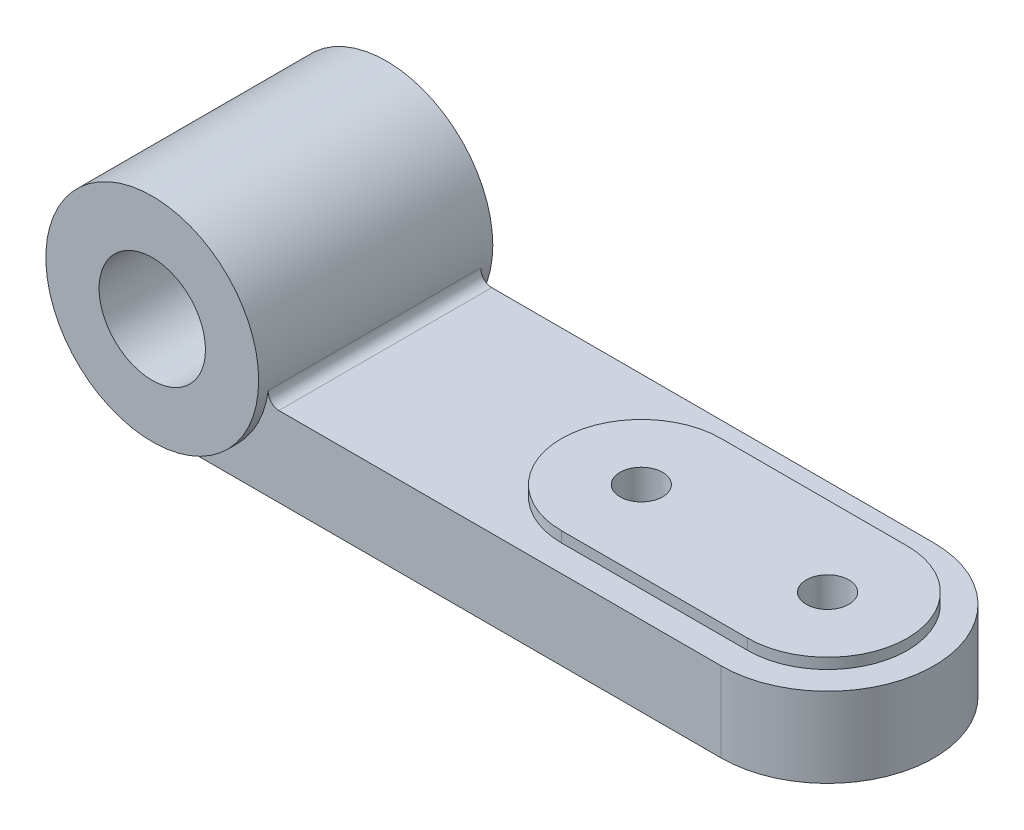
ISO-10303-21;
HEADER;
FILE_DESCRIPTION(('STEP AP214'),'2;1');
FILE_NAME('part.step','',(''),(''),'','','');
FILE_SCHEMA(('AUTOMOTIVE_DESIGN { 1 0 10303 214 1 1 1 1 }'));
ENDSEC;
DATA;
#1=APPLICATION_CONTEXT('core data for automotive mechanical design processes');
#2=APPLICATION_PROTOCOL_DEFINITION('international standard','automotive_design',2000,#1);
#3=PRODUCT_CONTEXT('',#1,'mechanical');
#4=PRODUCT('Part','Part','',(#3));
#5=PRODUCT_RELATED_PRODUCT_CATEGORY('part','',(#4));
#6=PRODUCT_DEFINITION_FORMATION('','',#4);
#7=PRODUCT_DEFINITION_CONTEXT('part definition',#1,'design');
#8=PRODUCT_DEFINITION('design','',#6,#7);
#9=PRODUCT_DEFINITION_SHAPE('','',#8);
#10=(LENGTH_UNIT() NAMED_UNIT(*) SI_UNIT(.MILLI.,.METRE.));
#11=(NAMED_UNIT(*) PLANE_ANGLE_UNIT() SI_UNIT($,.RADIAN.));
#12=(NAMED_UNIT(*) SI_UNIT($,.STERADIAN.) SOLID_ANGLE_UNIT());
#13=UNCERTAINTY_MEASURE_WITH_UNIT(LENGTH_MEASURE(1.E-05),#10,'distance_accuracy_value','');
#14=(GEOMETRIC_REPRESENTATION_CONTEXT(3) GLOBAL_UNCERTAINTY_ASSIGNED_CONTEXT((#13)) GLOBAL_UNIT_ASSIGNED_CONTEXT((#10,
#11,#12)) REPRESENTATION_CONTEXT('',''));
#15=CARTESIAN_POINT('',(0.,0.,0.));
#16=DIRECTION('',(0.,0.,1.));
#17=DIRECTION('',(1.,0.,0.));
#18=AXIS2_PLACEMENT_3D('',#15,#16,#17);
#19=CARTESIAN_POINT('',(0.,15.,0.));
#20=DIRECTION('',(0.,1.,0.));
#21=DIRECTION('',(0.,0.,1.));
#22=AXIS2_PLACEMENT_3D('',#19,#20,#21);
#23=PLANE('',#22);
#24=DIRECTION('',(1.,0.,0.));
#25=VECTOR('',#24,1.);
#26=CARTESIAN_POINT('',(0.,15.,-20.));
#27=LINE('',#26,#25);
#28=CARTESIAN_POINT('',(-30.6170706373276,15.,-20.));
#29=VERTEX_POINT('',#28);
#30=CARTESIAN_POINT('',(52.5,15.,-20.));
#31=VERTEX_POINT('',#30);
#32=EDGE_CURVE('E193',#29,#31,#27,.T.);
#33=ORIENTED_EDGE('',*,*,#32,.F.);
#34=DIRECTION('',(0.,0.,-1.));
#35=VECTOR('',#34,1.);
#36=CARTESIAN_POINT('',(-30.6170706373276,15.,20.));
#37=LINE('',#36,#35);
#38=CARTESIAN_POINT('',(-30.6170706373276,15.,20.));
#39=VERTEX_POINT('',#38);
#40=EDGE_CURVE('E56',#29,#39,#37,.F.);
#41=ORIENTED_EDGE('',*,*,#40,.T.);
#42=DIRECTION('',(1.,0.,0.));
#43=VECTOR('',#42,1.);
#44=CARTESIAN_POINT('',(0.,15.,20.));
#45=LINE('',#44,#43);
#46=CARTESIAN_POINT('',(52.5,15.,20.));
#47=VERTEX_POINT('',#46);
#48=EDGE_CURVE('E188',#39,#47,#45,.T.);
#49=ORIENTED_EDGE('',*,*,#48,.T.);
#50=CARTESIAN_POINT('',(52.5,15.,0.));
#51=DIRECTION('',(0.,1.,0.));
#52=DIRECTION('',(0.,0.,1.));
#53=AXIS2_PLACEMENT_3D('',#50,#51,#52);
#54=CIRCLE('',#53,20.);
#55=EDGE_CURVE('E196',#31,#47,#54,.F.);
#56=ORIENTED_EDGE('',*,*,#55,.F.);
#57=EDGE_LOOP('',(#33,#41,#49,#56));
#58=FACE_BOUND('',#57,.T.);
#59=DIRECTION('',(1.,0.,0.));
#60=VECTOR('',#59,1.);
#61=CARTESIAN_POINT('',(17.5,15.,15.));
#62=LINE('',#61,#60);
#63=CARTESIAN_POINT('',(17.5,15.,15.));
#64=VERTEX_POINT('',#63);
#65=CARTESIAN_POINT('',(52.5,15.,15.));
#66=VERTEX_POINT('',#65);
#67=EDGE_CURVE('E232',#64,#66,#62,.T.);
#68=ORIENTED_EDGE('',*,*,#67,.F.);
#69=CARTESIAN_POINT('',(17.5,15.,0.));
#70=DIRECTION('',(0.,1.,0.));
#71=DIRECTION('',(0.,0.,1.));
#72=AXIS2_PLACEMENT_3D('',#69,#70,#71);
#73=CIRCLE('',#72,15.);
#74=CARTESIAN_POINT('',(17.5,15.,-15.));
#75=VERTEX_POINT('',#74);
#76=EDGE_CURVE('E129',#75,#64,#73,.T.);
#77=ORIENTED_EDGE('',*,*,#76,.F.);
#78=DIRECTION('',(-1.,0.,0.));
#79=VECTOR('',#78,1.);
#80=CARTESIAN_POINT('',(17.5,15.,-15.));
#81=LINE('',#80,#79);
#82=CARTESIAN_POINT('',(52.5,15.,-15.));
#83=VERTEX_POINT('',#82);
#84=EDGE_CURVE('E125',#83,#75,#81,.T.);
#85=ORIENTED_EDGE('',*,*,#84,.F.);
#86=CARTESIAN_POINT('',(52.5,15.,0.));
#87=DIRECTION('',(0.,1.,0.));
#88=DIRECTION('',(0.,0.,1.));
#89=AXIS2_PLACEMENT_3D('',#86,#87,#88);
#90=CIRCLE('',#89,15.);
#91=EDGE_CURVE('E241',#66,#83,#90,.T.);
#92=ORIENTED_EDGE('',*,*,#91,.F.);
#93=EDGE_LOOP('',(#68,#77,#85,#92));
#94=FACE_BOUND('',#93,.T.);
#95=ADVANCED_FACE('F35',(#58,#94),#23,.T.);
#96=CARTESIAN_POINT('',(-52.4115922507301,19.9998046007922,-22.));
#97=DIRECTION('',(0.,0.,1.));
#98=DIRECTION('',(1.,0.,0.));
#99=AXIS2_PLACEMENT_3D('',#96,#97,#98);
#100=CYLINDRICAL_SURFACE('',#99,20.);
#101=DIRECTION('',(0.,0.,1.));
#102=VECTOR('',#101,1.);
#103=CARTESIAN_POINT('',(-32.5983907840006,17.2727095091629,-22.));
#104=LINE('',#103,#102);
#105=CARTESIAN_POINT('',(-32.5983907840006,17.2727095091629,20.));
#106=VERTEX_POINT('',#105);
#107=CARTESIAN_POINT('',(-32.5983907840006,17.2727095091629,-20.));
#108=VERTEX_POINT('',#107);
#109=EDGE_CURVE('E163',#106,#108,#104,.F.);
#110=ORIENTED_EDGE('',*,*,#109,.T.);
#111=CARTESIAN_POINT('',(-52.4115922507301,19.9998046007922,-20.));
#112=DIRECTION('',(0.,0.,-1.));
#113=DIRECTION('',(-1.,0.,0.));
#114=AXIS2_PLACEMENT_3D('',#111,#112,#113);
#115=CIRCLE('',#114,20.);
#116=CARTESIAN_POINT('',(-52.3231845014583,0.,-20.));
#117=VERTEX_POINT('',#116);
#118=EDGE_CURVE('E152',#108,#117,#115,.T.);
#119=ORIENTED_EDGE('',*,*,#118,.T.);
#120=DIRECTION('',(0.,0.,1.));
#121=VECTOR('',#120,1.);
#122=CARTESIAN_POINT('',(-52.3231845014583,0.,-22.));
#123=LINE('',#122,#121);
#124=CARTESIAN_POINT('',(-52.3231845014583,0.,20.));
#125=VERTEX_POINT('',#124);
#126=EDGE_CURVE('E160',#125,#117,#123,.F.);
#127=ORIENTED_EDGE('',*,*,#126,.F.);
#128=CARTESIAN_POINT('',(-52.4115922507301,19.9998046007922,20.));
#129=DIRECTION('',(0.,0.,-1.));
#130=DIRECTION('',(-1.,0.,0.));
#131=AXIS2_PLACEMENT_3D('',#128,#129,#130);
#132=CIRCLE('',#131,20.);
#133=EDGE_CURVE('E148',#106,#125,#132,.T.);
#134=ORIENTED_EDGE('',*,*,#133,.F.);
#135=EDGE_LOOP('',(#110,#119,#127,#134));
#136=FACE_BOUND('',#135,.T.);
#137=CARTESIAN_POINT('',(-52.4115922507301,19.9998046007922,22.));
#138=DIRECTION('',(0.,0.,1.));
#139=DIRECTION('',(1.,0.,0.));
#140=AXIS2_PLACEMENT_3D('',#137,#138,#139);
#141=CIRCLE('',#140,20.);
#142=CARTESIAN_POINT('',(-32.4115922507301,19.9998046007922,22.));
#143=VERTEX_POINT('',#142);
#144=EDGE_CURVE('E141',#143,#143,#141,.T.);
#145=ORIENTED_EDGE('',*,*,#144,.F.);
#146=EDGE_LOOP('',(#145));
#147=FACE_BOUND('',#146,.T.);
#148=CARTESIAN_POINT('',(-52.4115922507301,19.9998046007922,-22.));
#149=DIRECTION('',(0.,0.,1.));
#150=DIRECTION('',(1.,0.,0.));
#151=AXIS2_PLACEMENT_3D('',#148,#149,#150);
#152=CIRCLE('',#151,20.);
#153=CARTESIAN_POINT('',(-32.4115922507301,19.9998046007922,-22.));
#154=VERTEX_POINT('',#153);
#155=EDGE_CURVE('E145',#154,#154,#152,.T.);
#156=ORIENTED_EDGE('',*,*,#155,.T.);
#157=EDGE_LOOP('',(#156));
#158=FACE_BOUND('',#157,.T.);
#159=ADVANCED_FACE('F180',(#136,#147,#158),#100,.T.);
#160=CARTESIAN_POINT('',(-52.4115922507301,19.9998046007922,-22.));
#161=DIRECTION('',(0.,0.,1.));
#162=DIRECTION('',(1.,0.,0.));
#163=AXIS2_PLACEMENT_3D('',#160,#161,#162);
#164=PLANE('',#163);
#165=CARTESIAN_POINT('',(-52.4115922507301,19.9998046007922,-22.));
#166=DIRECTION('',(0.,0.,1.));
#167=DIRECTION('',(1.,0.,0.));
#168=AXIS2_PLACEMENT_3D('',#165,#166,#167);
#169=CIRCLE('',#168,10.);
#170=CARTESIAN_POINT('',(-42.4115922507301,19.9998046007922,-22.));
#171=VERTEX_POINT('',#170);
#172=EDGE_CURVE('E134',#171,#171,#169,.T.);
#173=ORIENTED_EDGE('',*,*,#172,.T.);
#174=EDGE_LOOP('',(#173));
#175=FACE_BOUND('',#174,.T.);
#176=ORIENTED_EDGE('',*,*,#155,.F.);
#177=EDGE_LOOP('',(#176));
#178=FACE_BOUND('',#177,.T.);
#179=ADVANCED_FACE('F258',(#175,#178),#164,.F.);
#180=CARTESIAN_POINT('',(-52.4115922507301,19.9998046007922,22.));
#181=DIRECTION('',(0.,0.,1.));
#182=DIRECTION('',(1.,0.,0.));
#183=AXIS2_PLACEMENT_3D('',#180,#181,#182);
#184=PLANE('',#183);
#185=CARTESIAN_POINT('',(-52.4115922507301,19.9998046007922,22.));
#186=DIRECTION('',(0.,0.,1.));
#187=DIRECTION('',(1.,0.,0.));
#188=AXIS2_PLACEMENT_3D('',#185,#186,#187);
#189=CIRCLE('',#188,10.);
#190=CARTESIAN_POINT('',(-42.4115922507301,19.9998046007922,22.));
#191=VERTEX_POINT('',#190);
#192=EDGE_CURVE('E131',#191,#191,#189,.T.);
#193=ORIENTED_EDGE('',*,*,#192,.F.);
#194=EDGE_LOOP('',(#193));
#195=FACE_BOUND('',#194,.T.);
#196=ORIENTED_EDGE('',*,*,#144,.T.);
#197=EDGE_LOOP('',(#196));
#198=FACE_BOUND('',#197,.T.);
#199=ADVANCED_FACE('F270',(#195,#198),#184,.T.);
#200=CARTESIAN_POINT('',(52.5,15.,0.));
#201=DIRECTION('',(0.,-1.,0.));
#202=DIRECTION('',(0.,0.,-1.));
#203=AXIS2_PLACEMENT_3D('',#200,#201,#202);
#204=CYLINDRICAL_SURFACE('',#203,20.);
#205=CARTESIAN_POINT('',(52.5,0.,0.));
#206=DIRECTION('',(0.,1.,0.));
#207=DIRECTION('',(0.,0.,1.));
#208=AXIS2_PLACEMENT_3D('',#205,#206,#207);
#209=CIRCLE('',#208,20.);
#210=CARTESIAN_POINT('',(52.5,0.,-20.));
#211=VERTEX_POINT('',#210);
#212=CARTESIAN_POINT('',(52.5,0.,20.));
#213=VERTEX_POINT('',#212);
#214=EDGE_CURVE('E173',#211,#213,#209,.F.);
#215=ORIENTED_EDGE('',*,*,#214,.F.);
#216=DIRECTION('',(0.,-1.,0.));
#217=VECTOR('',#216,1.);
#218=CARTESIAN_POINT('',(52.5,15.,-20.));
#219=LINE('',#218,#217);
#220=EDGE_CURVE('E164',#31,#211,#219,.T.);
#221=ORIENTED_EDGE('',*,*,#220,.F.);
#222=ORIENTED_EDGE('',*,*,#55,.T.);
#223=DIRECTION('',(0.,-1.,0.));
#224=VECTOR('',#223,1.);
#225=CARTESIAN_POINT('',(52.5,15.,20.));
#226=LINE('',#225,#224);
#227=EDGE_CURVE('E190',#47,#213,#226,.T.);
#228=ORIENTED_EDGE('',*,*,#227,.T.);
#229=EDGE_LOOP('',(#215,#221,#222,#228));
#230=FACE_BOUND('',#229,.T.);
#231=ADVANCED_FACE('F211',(#230),#204,.T.);
#232=CARTESIAN_POINT('',(0.,15.,-20.));
#233=DIRECTION('',(0.,0.,-1.));
#234=DIRECTION('',(-1.,0.,0.));
#235=AXIS2_PLACEMENT_3D('',#232,#233,#234);
#236=PLANE('',#235);
#237=ORIENTED_EDGE('',*,*,#118,.F.);
#238=CARTESIAN_POINT('',(-30.6170706373276,17.,-20.));
#239=DIRECTION('',(0.,0.,-1.));
#240=DIRECTION('',(-1.,0.,0.));
#241=AXIS2_PLACEMENT_3D('',#238,#239,#240);
#242=CIRCLE('',#241,2.);
#243=EDGE_CURVE('E43',#108,#29,#242,.F.);
#244=ORIENTED_EDGE('',*,*,#243,.T.);
#245=ORIENTED_EDGE('',*,*,#32,.T.);
#246=ORIENTED_EDGE('',*,*,#220,.T.);
#247=DIRECTION('',(1.,0.,0.));
#248=VECTOR('',#247,1.);
#249=CARTESIAN_POINT('',(0.,0.,-20.));
#250=LINE('',#249,#248);
#251=EDGE_CURVE('E168',#117,#211,#250,.T.);
#252=ORIENTED_EDGE('',*,*,#251,.F.);
#253=EDGE_LOOP('',(#237,#244,#245,#246,#252));
#254=FACE_BOUND('',#253,.T.);
#255=ADVANCED_FACE('F209',(#254),#236,.T.);
#256=CARTESIAN_POINT('',(52.5,15.,0.));
#257=DIRECTION('',(0.,-1.,0.));
#258=DIRECTION('',(0.,0.,-1.));
#259=AXIS2_PLACEMENT_3D('',#256,#257,#258);
#260=CYLINDRICAL_SURFACE('',#259,4.);
#261=CARTESIAN_POINT('',(52.5,0.,0.));
#262=DIRECTION('',(0.,1.,0.));
#263=DIRECTION('',(0.,0.,1.));
#264=AXIS2_PLACEMENT_3D('',#261,#262,#263);
#265=CIRCLE('',#264,4.);
#266=CARTESIAN_POINT('',(52.5,0.,4.));
#267=VERTEX_POINT('',#266);
#268=EDGE_CURVE('E167',#267,#267,#265,.T.);
#269=ORIENTED_EDGE('',*,*,#268,.F.);
#270=EDGE_LOOP('',(#269));
#271=FACE_BOUND('',#270,.T.);
#272=CARTESIAN_POINT('',(52.5,17.,0.));
#273=DIRECTION('',(0.,1.,0.));
#274=DIRECTION('',(0.,0.,1.));
#275=AXIS2_PLACEMENT_3D('',#272,#273,#274);
#276=CIRCLE('',#275,4.);
#277=CARTESIAN_POINT('',(52.5,17.,4.));
#278=VERTEX_POINT('',#277);
#279=EDGE_CURVE('E230',#278,#278,#276,.T.);
#280=ORIENTED_EDGE('',*,*,#279,.T.);
#281=EDGE_LOOP('',(#280));
#282=FACE_BOUND('',#281,.T.);
#283=ADVANCED_FACE('F262',(#271,#282),#260,.F.);
#284=CARTESIAN_POINT('',(0.,15.,20.));
#285=DIRECTION('',(0.,0.,-1.));
#286=DIRECTION('',(-1.,0.,0.));
#287=AXIS2_PLACEMENT_3D('',#284,#285,#286);
#288=PLANE('',#287);
#289=ORIENTED_EDGE('',*,*,#48,.F.);
#290=CARTESIAN_POINT('',(-30.6170706373276,17.,20.));
#291=DIRECTION('',(0.,0.,-1.));
#292=DIRECTION('',(-1.,0.,0.));
#293=AXIS2_PLACEMENT_3D('',#290,#291,#292);
#294=CIRCLE('',#293,2.);
#295=EDGE_CURVE('E11',#39,#106,#294,.T.);
#296=ORIENTED_EDGE('',*,*,#295,.T.);
#297=ORIENTED_EDGE('',*,*,#133,.T.);
#298=DIRECTION('',(1.,0.,0.));
#299=VECTOR('',#298,1.);
#300=CARTESIAN_POINT('',(0.,0.,20.));
#301=LINE('',#300,#299);
#302=EDGE_CURVE('E165',#125,#213,#301,.T.);
#303=ORIENTED_EDGE('',*,*,#302,.T.);
#304=ORIENTED_EDGE('',*,*,#227,.F.);
#305=EDGE_LOOP('',(#289,#296,#297,#303,#304));
#306=FACE_BOUND('',#305,.T.);
#307=ADVANCED_FACE('F185',(#306),#288,.F.);
#308=CARTESIAN_POINT('',(17.5,15.,0.));
#309=DIRECTION('',(0.,-1.,0.));
#310=DIRECTION('',(0.,0.,-1.));
#311=AXIS2_PLACEMENT_3D('',#308,#309,#310);
#312=CYLINDRICAL_SURFACE('',#311,4.);
#313=CARTESIAN_POINT('',(17.5,0.,0.));
#314=DIRECTION('',(0.,1.,0.));
#315=DIRECTION('',(0.,0.,1.));
#316=AXIS2_PLACEMENT_3D('',#313,#314,#315);
#317=CIRCLE('',#316,4.);
#318=CARTESIAN_POINT('',(17.5,0.,4.));
#319=VERTEX_POINT('',#318);
#320=EDGE_CURVE('E203',#319,#319,#317,.T.);
#321=ORIENTED_EDGE('',*,*,#320,.F.);
#322=EDGE_LOOP('',(#321));
#323=FACE_BOUND('',#322,.T.);
#324=CARTESIAN_POINT('',(17.5,17.,0.));
#325=DIRECTION('',(0.,1.,0.));
#326=DIRECTION('',(0.,0.,1.));
#327=AXIS2_PLACEMENT_3D('',#324,#325,#326);
#328=CIRCLE('',#327,4.);
#329=CARTESIAN_POINT('',(17.5,17.,4.));
#330=VERTEX_POINT('',#329);
#331=EDGE_CURVE('E228',#330,#330,#328,.T.);
#332=ORIENTED_EDGE('',*,*,#331,.T.);
#333=EDGE_LOOP('',(#332));
#334=FACE_BOUND('',#333,.T.);
#335=ADVANCED_FACE('F217',(#323,#334),#312,.F.);
#336=CARTESIAN_POINT('',(0.,0.,0.));
#337=DIRECTION('',(0.,1.,0.));
#338=DIRECTION('',(0.,0.,1.));
#339=AXIS2_PLACEMENT_3D('',#336,#337,#338);
#340=PLANE('',#339);
#341=ORIENTED_EDGE('',*,*,#302,.F.);
#342=ORIENTED_EDGE('',*,*,#126,.T.);
#343=ORIENTED_EDGE('',*,*,#251,.T.);
#344=ORIENTED_EDGE('',*,*,#214,.T.);
#345=EDGE_LOOP('',(#341,#342,#343,#344));
#346=FACE_BOUND('',#345,.T.);
#347=ORIENTED_EDGE('',*,*,#268,.T.);
#348=EDGE_LOOP('',(#347));
#349=FACE_BOUND('',#348,.T.);
#350=ORIENTED_EDGE('',*,*,#320,.T.);
#351=EDGE_LOOP('',(#350));
#352=FACE_BOUND('',#351,.T.);
#353=ADVANCED_FACE('F213',(#346,#349,#352),#340,.F.);
#354=CARTESIAN_POINT('',(-52.4115922507301,19.9998046007922,-22.));
#355=DIRECTION('',(0.,0.,1.));
#356=DIRECTION('',(1.,0.,0.));
#357=AXIS2_PLACEMENT_3D('',#354,#355,#356);
#358=CYLINDRICAL_SURFACE('',#357,10.);
#359=ORIENTED_EDGE('',*,*,#172,.F.);
#360=EDGE_LOOP('',(#359));
#361=FACE_BOUND('',#360,.T.);
#362=ORIENTED_EDGE('',*,*,#192,.T.);
#363=EDGE_LOOP('',(#362));
#364=FACE_BOUND('',#363,.T.);
#365=ADVANCED_FACE('F216',(#361,#364),#358,.F.);
#366=CARTESIAN_POINT('',(17.5,17.,0.));
#367=DIRECTION('',(0.,1.,0.));
#368=DIRECTION('',(0.,0.,1.));
#369=AXIS2_PLACEMENT_3D('',#366,#367,#368);
#370=PLANE('',#369);
#371=ORIENTED_EDGE('',*,*,#331,.F.);
#372=EDGE_LOOP('',(#371));
#373=FACE_BOUND('',#372,.T.);
#374=CARTESIAN_POINT('',(17.5,17.,0.));
#375=DIRECTION('',(0.,1.,0.));
#376=DIRECTION('',(0.,0.,1.));
#377=AXIS2_PLACEMENT_3D('',#374,#375,#376);
#378=CIRCLE('',#377,15.);
#379=CARTESIAN_POINT('',(17.5,17.,-15.));
#380=VERTEX_POINT('',#379);
#381=CARTESIAN_POINT('',(17.5,17.,15.));
#382=VERTEX_POINT('',#381);
#383=EDGE_CURVE('E115',#380,#382,#378,.T.);
#384=ORIENTED_EDGE('',*,*,#383,.T.);
#385=DIRECTION('',(1.,0.,0.));
#386=VECTOR('',#385,1.);
#387=CARTESIAN_POINT('',(17.5,17.,15.));
#388=LINE('',#387,#386);
#389=CARTESIAN_POINT('',(52.5,17.,15.));
#390=VERTEX_POINT('',#389);
#391=EDGE_CURVE('E104',#382,#390,#388,.T.);
#392=ORIENTED_EDGE('',*,*,#391,.T.);
#393=CARTESIAN_POINT('',(52.5,17.,0.));
#394=DIRECTION('',(0.,1.,0.));
#395=DIRECTION('',(0.,0.,1.));
#396=AXIS2_PLACEMENT_3D('',#393,#394,#395);
#397=CIRCLE('',#396,15.);
#398=CARTESIAN_POINT('',(52.5,17.,-15.));
#399=VERTEX_POINT('',#398);
#400=EDGE_CURVE('E114',#390,#399,#397,.T.);
#401=ORIENTED_EDGE('',*,*,#400,.T.);
#402=DIRECTION('',(-1.,0.,0.));
#403=VECTOR('',#402,1.);
#404=CARTESIAN_POINT('',(17.5,17.,-15.));
#405=LINE('',#404,#403);
#406=EDGE_CURVE('E121',#399,#380,#405,.T.);
#407=ORIENTED_EDGE('',*,*,#406,.T.);
#408=EDGE_LOOP('',(#384,#392,#401,#407));
#409=FACE_BOUND('',#408,.T.);
#410=ORIENTED_EDGE('',*,*,#279,.F.);
#411=EDGE_LOOP('',(#410));
#412=FACE_BOUND('',#411,.T.);
#413=ADVANCED_FACE('F118',(#373,#409,#412),#370,.T.);
#414=CARTESIAN_POINT('',(17.5,17.,0.));
#415=DIRECTION('',(0.,-1.,0.));
#416=DIRECTION('',(0.,0.,-1.));
#417=AXIS2_PLACEMENT_3D('',#414,#415,#416);
#418=CYLINDRICAL_SURFACE('',#417,15.);
#419=ORIENTED_EDGE('',*,*,#76,.T.);
#420=DIRECTION('',(0.,-1.,0.));
#421=VECTOR('',#420,1.);
#422=CARTESIAN_POINT('',(17.5,17.,15.));
#423=LINE('',#422,#421);
#424=EDGE_CURVE('E108',#382,#64,#423,.T.);
#425=ORIENTED_EDGE('',*,*,#424,.F.);
#426=ORIENTED_EDGE('',*,*,#383,.F.);
#427=DIRECTION('',(0.,-1.,0.));
#428=VECTOR('',#427,1.);
#429=CARTESIAN_POINT('',(17.5,17.,-15.));
#430=LINE('',#429,#428);
#431=EDGE_CURVE('E238',#380,#75,#430,.T.);
#432=ORIENTED_EDGE('',*,*,#431,.T.);
#433=EDGE_LOOP('',(#419,#425,#426,#432));
#434=FACE_BOUND('',#433,.T.);
#435=ADVANCED_FACE('F127',(#434),#418,.T.);
#436=CARTESIAN_POINT('',(17.5,17.,15.));
#437=DIRECTION('',(0.,0.,-1.));
#438=DIRECTION('',(-1.,0.,0.));
#439=AXIS2_PLACEMENT_3D('',#436,#437,#438);
#440=PLANE('',#439);
#441=ORIENTED_EDGE('',*,*,#67,.T.);
#442=DIRECTION('',(0.,-1.,0.));
#443=VECTOR('',#442,1.);
#444=CARTESIAN_POINT('',(52.5,17.,15.));
#445=LINE('',#444,#443);
#446=EDGE_CURVE('E111',#390,#66,#445,.T.);
#447=ORIENTED_EDGE('',*,*,#446,.F.);
#448=ORIENTED_EDGE('',*,*,#391,.F.);
#449=ORIENTED_EDGE('',*,*,#424,.T.);
#450=EDGE_LOOP('',(#441,#447,#448,#449));
#451=FACE_BOUND('',#450,.T.);
#452=ADVANCED_FACE('F106',(#451),#440,.F.);
#453=CARTESIAN_POINT('',(52.5,17.,0.));
#454=DIRECTION('',(0.,-1.,0.));
#455=DIRECTION('',(0.,0.,-1.));
#456=AXIS2_PLACEMENT_3D('',#453,#454,#455);
#457=CYLINDRICAL_SURFACE('',#456,15.);
#458=ORIENTED_EDGE('',*,*,#91,.T.);
#459=DIRECTION('',(0.,-1.,0.));
#460=VECTOR('',#459,1.);
#461=CARTESIAN_POINT('',(52.5,17.,-15.));
#462=LINE('',#461,#460);
#463=EDGE_CURVE('E136',#399,#83,#462,.T.);
#464=ORIENTED_EDGE('',*,*,#463,.F.);
#465=ORIENTED_EDGE('',*,*,#400,.F.);
#466=ORIENTED_EDGE('',*,*,#446,.T.);
#467=EDGE_LOOP('',(#458,#464,#465,#466));
#468=FACE_BOUND('',#467,.T.);
#469=ADVANCED_FACE('F251',(#468),#457,.T.);
#470=CARTESIAN_POINT('',(17.5,17.,-15.));
#471=DIRECTION('',(0.,0.,1.));
#472=DIRECTION('',(1.,0.,0.));
#473=AXIS2_PLACEMENT_3D('',#470,#471,#472);
#474=PLANE('',#473);
#475=ORIENTED_EDGE('',*,*,#84,.T.);
#476=ORIENTED_EDGE('',*,*,#431,.F.);
#477=ORIENTED_EDGE('',*,*,#406,.F.);
#478=ORIENTED_EDGE('',*,*,#463,.T.);
#479=EDGE_LOOP('',(#475,#476,#477,#478));
#480=FACE_BOUND('',#479,.T.);
#481=ADVANCED_FACE('F247',(#480),#474,.F.);
#482=CARTESIAN_POINT('',(-30.6170706373276,17.,-22.));
#483=DIRECTION('',(0.,0.,1.));
#484=DIRECTION('',(1.,0.,0.));
#485=AXIS2_PLACEMENT_3D('',#482,#483,#484);
#486=CYLINDRICAL_SURFACE('',#485,2.);
#487=ORIENTED_EDGE('',*,*,#295,.F.);
#488=ORIENTED_EDGE('',*,*,#40,.F.);
#489=ORIENTED_EDGE('',*,*,#243,.F.);
#490=ORIENTED_EDGE('',*,*,#109,.F.);
#491=EDGE_LOOP('',(#487,#488,#489,#490));
#492=FACE_BOUND('',#491,.T.);
#493=ADVANCED_FACE('F37',(#492),#486,.F.);
#494=CLOSED_SHELL('',(#95,#159,#179,#199,#231,#255,#283,#307,#335,#353,#365,#413,#435,#452,#469,
#481,#493));
#495=MANIFOLD_SOLID_BREP('B2',#494);
#496=ADVANCED_BREP_SHAPE_REPRESENTATION('',(#18,#495),#14);
#497=SHAPE_DEFINITION_REPRESENTATION(#9,#496);
ENDSEC;
END-ISO-10303-21;
